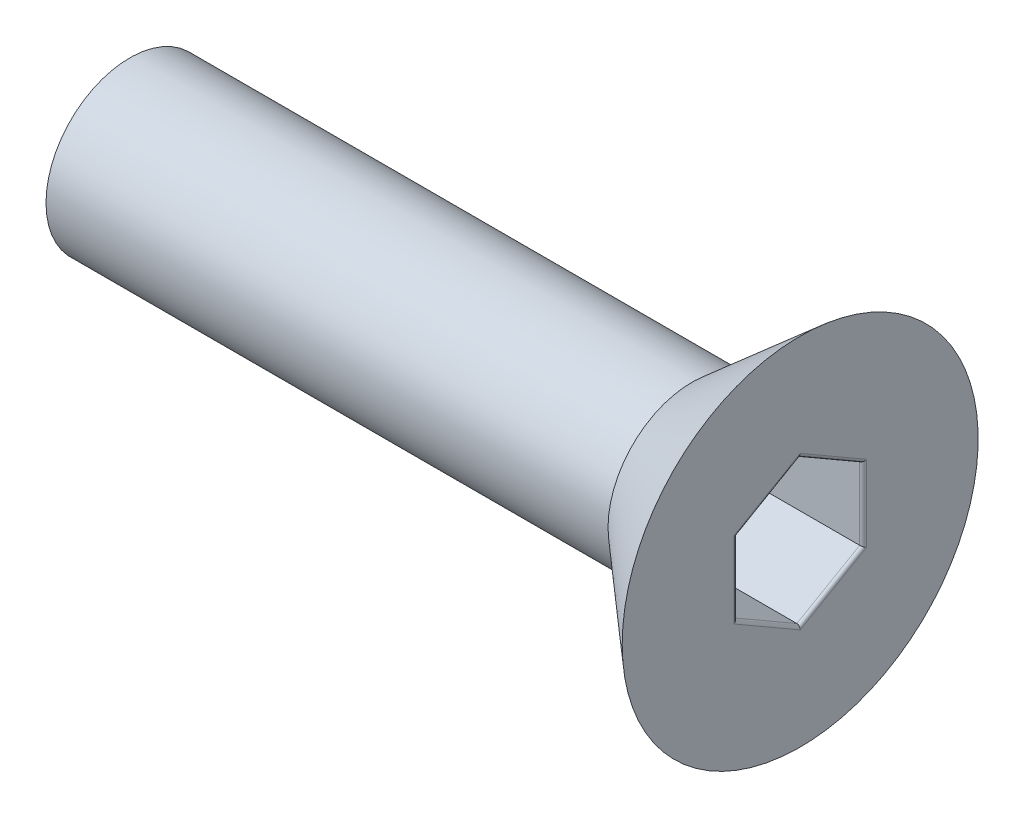
ISO-10303-21;
HEADER;
FILE_DESCRIPTION(('STEP AP214'),'2;1');
FILE_NAME('part.step','',(''),(''),'','','');
FILE_SCHEMA(('AUTOMOTIVE_DESIGN { 1 0 10303 214 1 1 1 1 }'));
ENDSEC;
DATA;
#1=APPLICATION_CONTEXT('core data for automotive mechanical design processes');
#2=APPLICATION_PROTOCOL_DEFINITION('international standard','automotive_design',2000,#1);
#3=PRODUCT_CONTEXT('',#1,'mechanical');
#4=PRODUCT('Part','Part','',(#3));
#5=PRODUCT_RELATED_PRODUCT_CATEGORY('part','',(#4));
#6=PRODUCT_DEFINITION_FORMATION('','',#4);
#7=PRODUCT_DEFINITION_CONTEXT('part definition',#1,'design');
#8=PRODUCT_DEFINITION('design','',#6,#7);
#9=PRODUCT_DEFINITION_SHAPE('','',#8);
#10=(LENGTH_UNIT() NAMED_UNIT(*) SI_UNIT(.MILLI.,.METRE.));
#11=(NAMED_UNIT(*) PLANE_ANGLE_UNIT() SI_UNIT($,.RADIAN.));
#12=(NAMED_UNIT(*) SI_UNIT($,.STERADIAN.) SOLID_ANGLE_UNIT());
#13=UNCERTAINTY_MEASURE_WITH_UNIT(LENGTH_MEASURE(1.E-05),#10,'distance_accuracy_value','');
#14=(GEOMETRIC_REPRESENTATION_CONTEXT(3) GLOBAL_UNCERTAINTY_ASSIGNED_CONTEXT((#13)) GLOBAL_UNIT_ASSIGNED_CONTEXT((#10,
#11,#12)) REPRESENTATION_CONTEXT('',''));
#15=CARTESIAN_POINT('',(0.,0.,0.));
#16=DIRECTION('',(0.,0.,1.));
#17=DIRECTION('',(1.,0.,0.));
#18=AXIS2_PLACEMENT_3D('',#15,#16,#17);
#19=CARTESIAN_POINT('',(0.,0.,0.));
#20=DIRECTION('',(-1.,0.,0.));
#21=DIRECTION('',(0.,0.,1.));
#22=AXIS2_PLACEMENT_3D('',#19,#20,#21);
#23=PLANE('',#22);
#24=DIRECTION('',(0.,0.5,0.866025403784439));
#25=VECTOR('',#24,1.);
#26=CARTESIAN_POINT('',(0.,2.17220821904232,-1.254125));
#27=LINE('',#26,#25);
#28=CARTESIAN_POINT('',(0.,2.89627762538976,0.));
#29=VERTEX_POINT('',#28);
#30=CARTESIAN_POINT('',(0.,1.44813881269488,-2.50825));
#31=VERTEX_POINT('',#30);
#32=EDGE_CURVE('E157',#29,#31,#27,.F.);
#33=ORIENTED_EDGE('',*,*,#32,.T.);
#34=DIRECTION('',(0.,1.,0.));
#35=VECTOR('',#34,1.);
#36=CARTESIAN_POINT('',(0.,0.,-2.50825));
#37=LINE('',#36,#35);
#38=CARTESIAN_POINT('',(0.,-1.44813881269488,-2.50825));
#39=VERTEX_POINT('',#38);
#40=EDGE_CURVE('E167',#31,#39,#37,.F.);
#41=ORIENTED_EDGE('',*,*,#40,.T.);
#42=DIRECTION('',(0.,0.5,-0.866025403784439));
#43=VECTOR('',#42,1.);
#44=CARTESIAN_POINT('',(0.,-2.17220821904232,-1.254125));
#45=LINE('',#44,#43);
#46=CARTESIAN_POINT('',(0.,-2.89627762538976,0.));
#47=VERTEX_POINT('',#46);
#48=EDGE_CURVE('E165',#39,#47,#45,.F.);
#49=ORIENTED_EDGE('',*,*,#48,.T.);
#50=DIRECTION('',(0.,-0.5,-0.866025403784439));
#51=VECTOR('',#50,1.);
#52=CARTESIAN_POINT('',(0.,-2.17220821904232,1.254125));
#53=LINE('',#52,#51);
#54=CARTESIAN_POINT('',(0.,-1.44813881269488,2.50825));
#55=VERTEX_POINT('',#54);
#56=EDGE_CURVE('E163',#47,#55,#53,.F.);
#57=ORIENTED_EDGE('',*,*,#56,.T.);
#58=DIRECTION('',(0.,-1.,0.));
#59=VECTOR('',#58,1.);
#60=CARTESIAN_POINT('',(0.,0.,2.50825));
#61=LINE('',#60,#59);
#62=CARTESIAN_POINT('',(0.,1.44813881269488,2.50825));
#63=VERTEX_POINT('',#62);
#64=EDGE_CURVE('E161',#55,#63,#61,.F.);
#65=ORIENTED_EDGE('',*,*,#64,.T.);
#66=DIRECTION('',(0.,-0.5,0.866025403784439));
#67=VECTOR('',#66,1.);
#68=CARTESIAN_POINT('',(0.,2.17220821904232,1.254125));
#69=LINE('',#68,#67);
#70=EDGE_CURVE('E159',#63,#29,#69,.F.);
#71=ORIENTED_EDGE('',*,*,#70,.T.);
#72=EDGE_LOOP('',(#33,#41,#49,#57,#65,#71));
#73=FACE_BOUND('',#72,.T.);
#74=CARTESIAN_POINT('',(0.,0.,0.));
#75=DIRECTION('',(-1.,0.,0.));
#76=DIRECTION('',(0.,0.,1.));
#77=AXIS2_PLACEMENT_3D('',#74,#75,#76);
#78=CIRCLE('',#77,6.7437);
#79=CARTESIAN_POINT('',(0.,0.,6.7437));
#80=VERTEX_POINT('',#79);
#81=EDGE_CURVE('E151',#80,#80,#78,.T.);
#82=ORIENTED_EDGE('',*,*,#81,.F.);
#83=EDGE_LOOP('',(#82));
#84=FACE_BOUND('',#83,.T.);
#85=ADVANCED_FACE('F33',(#73,#84),#23,.F.);
#86=CARTESIAN_POINT('',(0.,0.,0.));
#87=DIRECTION('',(1.,0.,0.));
#88=DIRECTION('',(0.,0.,-1.));
#89=AXIS2_PLACEMENT_3D('',#86,#87,#88);
#90=CONICAL_SURFACE('',#89,6.7437,0.71558499331767);
#91=CARTESIAN_POINT('',(-4.10531973484966,0.,0.));
#92=DIRECTION('',(-1.,0.,0.));
#93=DIRECTION('',(0.,0.,1.));
#94=AXIS2_PLACEMENT_3D('',#91,#92,#93);
#95=CIRCLE('',#94,3.175);
#96=CARTESIAN_POINT('',(-4.10531973484966,0.,3.175));
#97=VERTEX_POINT('',#96);
#98=EDGE_CURVE('E148',#97,#97,#95,.T.);
#99=ORIENTED_EDGE('',*,*,#98,.F.);
#100=EDGE_LOOP('',(#99));
#101=FACE_BOUND('',#100,.T.);
#102=ORIENTED_EDGE('',*,*,#81,.T.);
#103=EDGE_LOOP('',(#102));
#104=FACE_BOUND('',#103,.T.);
#105=ADVANCED_FACE('F235',(#101,#104),#90,.T.);
#106=CARTESIAN_POINT('',(-25.4,0.,0.));
#107=DIRECTION('',(-1.,0.,0.));
#108=DIRECTION('',(0.,0.,1.));
#109=AXIS2_PLACEMENT_3D('',#106,#107,#108);
#110=CYLINDRICAL_SURFACE('',#109,3.175);
#111=CARTESIAN_POINT('',(-25.4,0.,0.));
#112=DIRECTION('',(-1.,0.,0.));
#113=DIRECTION('',(0.,0.,1.));
#114=AXIS2_PLACEMENT_3D('',#111,#112,#113);
#115=CIRCLE('',#114,3.175);
#116=CARTESIAN_POINT('',(-25.4,0.,3.175));
#117=VERTEX_POINT('',#116);
#118=EDGE_CURVE('E135',#117,#117,#115,.T.);
#119=ORIENTED_EDGE('',*,*,#118,.F.);
#120=EDGE_LOOP('',(#119));
#121=FACE_BOUND('',#120,.T.);
#122=ORIENTED_EDGE('',*,*,#98,.T.);
#123=EDGE_LOOP('',(#122));
#124=FACE_BOUND('',#123,.T.);
#125=ADVANCED_FACE('F240',(#121,#124),#110,.T.);
#126=CARTESIAN_POINT('',(-25.4,0.,-3.175));
#127=DIRECTION('',(1.,0.,0.));
#128=DIRECTION('',(0.,0.,-1.));
#129=AXIS2_PLACEMENT_3D('',#126,#127,#128);
#130=PLANE('',#129);
#131=ORIENTED_EDGE('',*,*,#118,.T.);
#132=EDGE_LOOP('',(#131));
#133=FACE_BOUND('',#132,.T.);
#134=ADVANCED_FACE('F271',(#133),#130,.F.);
#135=CARTESIAN_POINT('',(-3.81,1.3748153285078,-2.38125));
#136=DIRECTION('',(0.,0.866025403784439,-0.5));
#137=DIRECTION('',(0.,0.5,0.866025403784439));
#138=AXIS2_PLACEMENT_3D('',#135,#136,#137);
#139=PLANE('',#138);
#140=DIRECTION('',(1.,0.,0.));
#141=VECTOR('',#140,1.);
#142=CARTESIAN_POINT('',(-3.81,1.3748153285078,-2.38125));
#143=LINE('',#142,#141);
#144=CARTESIAN_POINT('',(-3.81,1.3748153285078,-2.38125));
#145=VERTEX_POINT('',#144);
#146=CARTESIAN_POINT('',(-0.127000000000001,1.3748153285078,-2.38125));
#147=VERTEX_POINT('',#146);
#148=EDGE_CURVE('E133',#145,#147,#143,.T.);
#149=ORIENTED_EDGE('',*,*,#148,.T.);
#150=DIRECTION('',(0.,0.5,0.866025403784439));
#151=VECTOR('',#150,1.);
#152=CARTESIAN_POINT('',(-0.127,1.3748153285078,-2.38125));
#153=LINE('',#152,#151);
#154=CARTESIAN_POINT('',(-0.127000000000001,2.7496306570156,0.));
#155=VERTEX_POINT('',#154);
#156=EDGE_CURVE('E11',#147,#155,#153,.T.);
#157=ORIENTED_EDGE('',*,*,#156,.T.);
#158=DIRECTION('',(1.,0.,0.));
#159=VECTOR('',#158,1.);
#160=CARTESIAN_POINT('',(-3.81,2.7496306570156,0.));
#161=LINE('',#160,#159);
#162=CARTESIAN_POINT('',(-3.81,2.7496306570156,0.));
#163=VERTEX_POINT('',#162);
#164=EDGE_CURVE('E102',#163,#155,#161,.T.);
#165=ORIENTED_EDGE('',*,*,#164,.F.);
#166=DIRECTION('',(0.,0.5,0.866025403784439));
#167=VECTOR('',#166,1.);
#168=CARTESIAN_POINT('',(-3.81,1.3748153285078,-2.38125));
#169=LINE('',#168,#167);
#170=EDGE_CURVE('E106',#145,#163,#169,.T.);
#171=ORIENTED_EDGE('',*,*,#170,.F.);
#172=EDGE_LOOP('',(#149,#157,#165,#171));
#173=FACE_BOUND('',#172,.T.);
#174=ADVANCED_FACE('F104',(#173),#139,.F.);
#175=CARTESIAN_POINT('',(-3.81,-1.3748153285078,-2.38125));
#176=DIRECTION('',(0.,0.,-1.));
#177=DIRECTION('',(-1.,0.,0.));
#178=AXIS2_PLACEMENT_3D('',#175,#176,#177);
#179=PLANE('',#178);
#180=DIRECTION('',(1.,0.,0.));
#181=VECTOR('',#180,1.);
#182=CARTESIAN_POINT('',(-3.81,-1.3748153285078,-2.38125));
#183=LINE('',#182,#181);
#184=CARTESIAN_POINT('',(-3.81,-1.3748153285078,-2.38125));
#185=VERTEX_POINT('',#184);
#186=CARTESIAN_POINT('',(-0.127000000000001,-1.3748153285078,-2.38125));
#187=VERTEX_POINT('',#186);
#188=EDGE_CURVE('E136',#185,#187,#183,.T.);
#189=ORIENTED_EDGE('',*,*,#188,.T.);
#190=DIRECTION('',(0.,1.,0.));
#191=VECTOR('',#190,1.);
#192=CARTESIAN_POINT('',(-0.127,-1.3748153285078,-2.38125));
#193=LINE('',#192,#191);
#194=EDGE_CURVE('E154',#187,#147,#193,.T.);
#195=ORIENTED_EDGE('',*,*,#194,.T.);
#196=ORIENTED_EDGE('',*,*,#148,.F.);
#197=DIRECTION('',(0.,1.,0.));
#198=VECTOR('',#197,1.);
#199=CARTESIAN_POINT('',(-3.81,-1.3748153285078,-2.38125));
#200=LINE('',#199,#198);
#201=EDGE_CURVE('E109',#185,#145,#200,.T.);
#202=ORIENTED_EDGE('',*,*,#201,.F.);
#203=EDGE_LOOP('',(#189,#195,#196,#202));
#204=FACE_BOUND('',#203,.T.);
#205=ADVANCED_FACE('F205',(#204),#179,.F.);
#206=CARTESIAN_POINT('',(-3.81,-2.74963065701559,0.));
#207=DIRECTION('',(0.,-0.866025403784439,-0.5));
#208=DIRECTION('',(0.,0.5,-0.866025403784439));
#209=AXIS2_PLACEMENT_3D('',#206,#207,#208);
#210=PLANE('',#209);
#211=DIRECTION('',(1.,0.,0.));
#212=VECTOR('',#211,1.);
#213=CARTESIAN_POINT('',(-3.81,-2.74963065701559,0.));
#214=LINE('',#213,#212);
#215=CARTESIAN_POINT('',(-3.81,-2.74963065701559,0.));
#216=VERTEX_POINT('',#215);
#217=CARTESIAN_POINT('',(-0.127000000000001,-2.74963065701559,0.));
#218=VERTEX_POINT('',#217);
#219=EDGE_CURVE('E139',#216,#218,#214,.T.);
#220=ORIENTED_EDGE('',*,*,#219,.T.);
#221=DIRECTION('',(0.,0.5,-0.866025403784439));
#222=VECTOR('',#221,1.);
#223=CARTESIAN_POINT('',(-0.127,-2.74963065701559,0.));
#224=LINE('',#223,#222);
#225=EDGE_CURVE('E170',#218,#187,#224,.T.);
#226=ORIENTED_EDGE('',*,*,#225,.T.);
#227=ORIENTED_EDGE('',*,*,#188,.F.);
#228=DIRECTION('',(0.,0.5,-0.866025403784439));
#229=VECTOR('',#228,1.);
#230=CARTESIAN_POINT('',(-3.81,-2.74963065701559,0.));
#231=LINE('',#230,#229);
#232=EDGE_CURVE('E130',#216,#185,#231,.T.);
#233=ORIENTED_EDGE('',*,*,#232,.F.);
#234=EDGE_LOOP('',(#220,#226,#227,#233));
#235=FACE_BOUND('',#234,.T.);
#236=ADVANCED_FACE('F225',(#235),#210,.F.);
#237=CARTESIAN_POINT('',(-3.81,-1.3748153285078,2.38125));
#238=DIRECTION('',(0.,-0.866025403784438,0.5));
#239=DIRECTION('',(0.,-0.5,-0.866025403784439));
#240=AXIS2_PLACEMENT_3D('',#237,#238,#239);
#241=PLANE('',#240);
#242=DIRECTION('',(1.,0.,0.));
#243=VECTOR('',#242,1.);
#244=CARTESIAN_POINT('',(-3.81,-1.3748153285078,2.38125));
#245=LINE('',#244,#243);
#246=CARTESIAN_POINT('',(-3.81,-1.3748153285078,2.38125));
#247=VERTEX_POINT('',#246);
#248=CARTESIAN_POINT('',(-0.127000000000001,-1.3748153285078,2.38125));
#249=VERTEX_POINT('',#248);
#250=EDGE_CURVE('E142',#247,#249,#245,.T.);
#251=ORIENTED_EDGE('',*,*,#250,.T.);
#252=DIRECTION('',(0.,-0.5,-0.866025403784439));
#253=VECTOR('',#252,1.);
#254=CARTESIAN_POINT('',(-0.127,-1.3748153285078,2.38125));
#255=LINE('',#254,#253);
#256=EDGE_CURVE('E172',#249,#218,#255,.T.);
#257=ORIENTED_EDGE('',*,*,#256,.T.);
#258=ORIENTED_EDGE('',*,*,#219,.F.);
#259=DIRECTION('',(0.,-0.5,-0.866025403784439));
#260=VECTOR('',#259,1.);
#261=CARTESIAN_POINT('',(-3.81,-1.3748153285078,2.38125));
#262=LINE('',#261,#260);
#263=EDGE_CURVE('E127',#247,#216,#262,.T.);
#264=ORIENTED_EDGE('',*,*,#263,.F.);
#265=EDGE_LOOP('',(#251,#257,#258,#264));
#266=FACE_BOUND('',#265,.T.);
#267=ADVANCED_FACE('F201',(#266),#241,.F.);
#268=CARTESIAN_POINT('',(-3.81,1.3748153285078,2.38125));
#269=DIRECTION('',(0.,0.,1.));
#270=DIRECTION('',(0.,-1.,0.));
#271=AXIS2_PLACEMENT_3D('',#268,#269,#270);
#272=PLANE('',#271);
#273=DIRECTION('',(1.,0.,0.));
#274=VECTOR('',#273,1.);
#275=CARTESIAN_POINT('',(-3.81,1.3748153285078,2.38125));
#276=LINE('',#275,#274);
#277=CARTESIAN_POINT('',(-3.81,1.3748153285078,2.38125));
#278=VERTEX_POINT('',#277);
#279=CARTESIAN_POINT('',(-0.127000000000001,1.3748153285078,2.38125));
#280=VERTEX_POINT('',#279);
#281=EDGE_CURVE('E108',#278,#280,#276,.T.);
#282=ORIENTED_EDGE('',*,*,#281,.T.);
#283=DIRECTION('',(0.,-1.,0.));
#284=VECTOR('',#283,1.);
#285=CARTESIAN_POINT('',(-0.127,1.3748153285078,2.38125));
#286=LINE('',#285,#284);
#287=EDGE_CURVE('E174',#280,#249,#286,.T.);
#288=ORIENTED_EDGE('',*,*,#287,.T.);
#289=ORIENTED_EDGE('',*,*,#250,.F.);
#290=DIRECTION('',(0.,-1.,0.));
#291=VECTOR('',#290,1.);
#292=CARTESIAN_POINT('',(-3.81,1.3748153285078,2.38125));
#293=LINE('',#292,#291);
#294=EDGE_CURVE('E117',#278,#247,#293,.T.);
#295=ORIENTED_EDGE('',*,*,#294,.F.);
#296=EDGE_LOOP('',(#282,#288,#289,#295));
#297=FACE_BOUND('',#296,.T.);
#298=ADVANCED_FACE('F198',(#297),#272,.F.);
#299=CARTESIAN_POINT('',(-3.81,2.7496306570156,0.));
#300=DIRECTION('',(0.,0.866025403784439,0.5));
#301=DIRECTION('',(0.,-0.5,0.866025403784439));
#302=AXIS2_PLACEMENT_3D('',#299,#300,#301);
#303=PLANE('',#302);
#304=ORIENTED_EDGE('',*,*,#164,.T.);
#305=DIRECTION('',(0.,-0.5,0.866025403784439));
#306=VECTOR('',#305,1.);
#307=CARTESIAN_POINT('',(-0.127,2.7496306570156,0.));
#308=LINE('',#307,#306);
#309=EDGE_CURVE('E42',#155,#280,#308,.T.);
#310=ORIENTED_EDGE('',*,*,#309,.T.);
#311=ORIENTED_EDGE('',*,*,#281,.F.);
#312=DIRECTION('',(0.,-0.5,0.866025403784439));
#313=VECTOR('',#312,1.);
#314=CARTESIAN_POINT('',(-3.81,2.7496306570156,0.));
#315=LINE('',#314,#313);
#316=EDGE_CURVE('E112',#163,#278,#315,.T.);
#317=ORIENTED_EDGE('',*,*,#316,.F.);
#318=EDGE_LOOP('',(#304,#310,#311,#317));
#319=FACE_BOUND('',#318,.T.);
#320=ADVANCED_FACE('F113',(#319),#303,.F.);
#321=CARTESIAN_POINT('',(-3.81,2.7496306570156,0.));
#322=DIRECTION('',(1.,0.,0.));
#323=DIRECTION('',(0.,0.,-1.));
#324=AXIS2_PLACEMENT_3D('',#321,#322,#323);
#325=PLANE('',#324);
#326=ORIENTED_EDGE('',*,*,#170,.T.);
#327=ORIENTED_EDGE('',*,*,#316,.T.);
#328=ORIENTED_EDGE('',*,*,#294,.T.);
#329=ORIENTED_EDGE('',*,*,#263,.T.);
#330=ORIENTED_EDGE('',*,*,#232,.T.);
#331=ORIENTED_EDGE('',*,*,#201,.T.);
#332=EDGE_LOOP('',(#326,#327,#328,#329,#330,#331));
#333=FACE_BOUND('',#332,.T.);
#334=ADVANCED_FACE('F119',(#333),#325,.T.);
#335=CARTESIAN_POINT('',(-0.127,1.3748153285078,2.50825));
#336=DIRECTION('',(0.,-1.,0.));
#337=DIRECTION('',(0.,0.,-1.));
#338=AXIS2_PLACEMENT_3D('',#335,#336,#337);
#339=CYLINDRICAL_SURFACE('',#338,0.127);
#340=CARTESIAN_POINT('',(-0.127,1.44813881269488,2.50825));
#341=DIRECTION('',(0.,-0.866025403784439,0.5));
#342=DIRECTION('',(0.,-0.5,-0.866025403784439));
#343=AXIS2_PLACEMENT_3D('',#340,#341,#342);
#344=ELLIPSE('',#343,0.146646968374165,0.127);
#345=EDGE_CURVE('E124',#63,#280,#344,.F.);
#346=ORIENTED_EDGE('',*,*,#345,.F.);
#347=ORIENTED_EDGE('',*,*,#64,.F.);
#348=CARTESIAN_POINT('',(-0.127,-1.44813881269488,2.50825));
#349=DIRECTION('',(0.,-0.866025403784439,-0.5));
#350=DIRECTION('',(0.,0.5,-0.866025403784439));
#351=AXIS2_PLACEMENT_3D('',#348,#349,#350);
#352=ELLIPSE('',#351,0.146646968374165,0.127);
#353=EDGE_CURVE('E37',#249,#55,#352,.T.);
#354=ORIENTED_EDGE('',*,*,#353,.F.);
#355=ORIENTED_EDGE('',*,*,#287,.F.);
#356=EDGE_LOOP('',(#346,#347,#354,#355));
#357=FACE_BOUND('',#356,.T.);
#358=ADVANCED_FACE('F35',(#357),#339,.T.);
#359=CARTESIAN_POINT('',(-0.127,-1.48480055478842,2.44475));
#360=DIRECTION('',(0.,-0.5,-0.866025403784439));
#361=DIRECTION('',(0.,0.866025403784438,-0.5));
#362=AXIS2_PLACEMENT_3D('',#359,#360,#361);
#363=CYLINDRICAL_SURFACE('',#362,0.127);
#364=ORIENTED_EDGE('',*,*,#353,.T.);
#365=ORIENTED_EDGE('',*,*,#56,.F.);
#366=CARTESIAN_POINT('',(-0.127,-2.89627762538976,0.));
#367=DIRECTION('',(0.,0.,-1.));
#368=DIRECTION('',(0.,1.,0.));
#369=AXIS2_PLACEMENT_3D('',#366,#367,#368);
#370=ELLIPSE('',#369,0.146646968374165,0.127);
#371=EDGE_CURVE('E184',#218,#47,#370,.T.);
#372=ORIENTED_EDGE('',*,*,#371,.F.);
#373=ORIENTED_EDGE('',*,*,#256,.F.);
#374=EDGE_LOOP('',(#364,#365,#372,#373));
#375=FACE_BOUND('',#374,.T.);
#376=ADVANCED_FACE('F221',(#375),#363,.T.);
#377=CARTESIAN_POINT('',(-0.127,2.85961588329622,0.0634999999999999));
#378=DIRECTION('',(0.,-0.5,0.866025403784439));
#379=DIRECTION('',(0.,-0.866025403784439,-0.5));
#380=AXIS2_PLACEMENT_3D('',#377,#378,#379);
#381=CYLINDRICAL_SURFACE('',#380,0.127);
#382=ORIENTED_EDGE('',*,*,#345,.T.);
#383=ORIENTED_EDGE('',*,*,#309,.F.);
#384=CARTESIAN_POINT('',(-0.127,2.89627762538976,0.));
#385=DIRECTION('',(0.,0.,1.));
#386=DIRECTION('',(0.,-1.,0.));
#387=AXIS2_PLACEMENT_3D('',#384,#385,#386);
#388=ELLIPSE('',#387,0.146646968374165,0.127);
#389=EDGE_CURVE('E181',#29,#155,#388,.F.);
#390=ORIENTED_EDGE('',*,*,#389,.F.);
#391=ORIENTED_EDGE('',*,*,#70,.F.);
#392=EDGE_LOOP('',(#382,#383,#390,#391));
#393=FACE_BOUND('',#392,.T.);
#394=ADVANCED_FACE('F190',(#393),#381,.T.);
#395=CARTESIAN_POINT('',(-0.127,-2.85961588329622,-0.0634999999999989));
#396=DIRECTION('',(0.,0.5,-0.866025403784439));
#397=DIRECTION('',(0.,0.866025403784439,0.5));
#398=AXIS2_PLACEMENT_3D('',#395,#396,#397);
#399=CYLINDRICAL_SURFACE('',#398,0.127);
#400=ORIENTED_EDGE('',*,*,#371,.T.);
#401=ORIENTED_EDGE('',*,*,#48,.F.);
#402=CARTESIAN_POINT('',(-0.127,-1.44813881269488,-2.50825));
#403=DIRECTION('',(0.,0.866025403784439,-0.5));
#404=DIRECTION('',(0.,0.5,0.866025403784439));
#405=AXIS2_PLACEMENT_3D('',#402,#403,#404);
#406=ELLIPSE('',#405,0.146646968374165,0.127);
#407=EDGE_CURVE('E179',#187,#39,#406,.T.);
#408=ORIENTED_EDGE('',*,*,#407,.F.);
#409=ORIENTED_EDGE('',*,*,#225,.F.);
#410=EDGE_LOOP('',(#400,#401,#408,#409));
#411=FACE_BOUND('',#410,.T.);
#412=ADVANCED_FACE('F224',(#411),#399,.T.);
#413=CARTESIAN_POINT('',(-0.127,1.48480055478842,-2.44475));
#414=DIRECTION('',(0.,0.5,0.866025403784439));
#415=DIRECTION('',(0.,-0.866025403784439,0.5));
#416=AXIS2_PLACEMENT_3D('',#413,#414,#415);
#417=CYLINDRICAL_SURFACE('',#416,0.127);
#418=ORIENTED_EDGE('',*,*,#389,.T.);
#419=ORIENTED_EDGE('',*,*,#156,.F.);
#420=CARTESIAN_POINT('',(-0.127,1.44813881269488,-2.50825));
#421=DIRECTION('',(0.,0.866025403784439,0.5));
#422=DIRECTION('',(0.,0.5,-0.866025403784439));
#423=AXIS2_PLACEMENT_3D('',#420,#421,#422);
#424=ELLIPSE('',#423,0.146646968374165,0.127);
#425=EDGE_CURVE('E177',#31,#147,#424,.F.);
#426=ORIENTED_EDGE('',*,*,#425,.F.);
#427=ORIENTED_EDGE('',*,*,#32,.F.);
#428=EDGE_LOOP('',(#418,#419,#426,#427));
#429=FACE_BOUND('',#428,.T.);
#430=ADVANCED_FACE('F215',(#429),#417,.T.);
#431=CARTESIAN_POINT('',(-0.127,-1.3748153285078,-2.50825));
#432=DIRECTION('',(0.,1.,0.));
#433=DIRECTION('',(0.,0.,1.));
#434=AXIS2_PLACEMENT_3D('',#431,#432,#433);
#435=CYLINDRICAL_SURFACE('',#434,0.127);
#436=ORIENTED_EDGE('',*,*,#407,.T.);
#437=ORIENTED_EDGE('',*,*,#40,.F.);
#438=ORIENTED_EDGE('',*,*,#425,.T.);
#439=ORIENTED_EDGE('',*,*,#194,.F.);
#440=EDGE_LOOP('',(#436,#437,#438,#439));
#441=FACE_BOUND('',#440,.T.);
#442=ADVANCED_FACE('F209',(#441),#435,.T.);
#443=CLOSED_SHELL('',(#85,#105,#125,#134,#174,#205,#236,#267,#298,#320,#334,#358,#376,#394,#412,
#430,#442));
#444=MANIFOLD_SOLID_BREP('B2',#443);
#445=ADVANCED_BREP_SHAPE_REPRESENTATION('',(#18,#444),#14);
#446=SHAPE_DEFINITION_REPRESENTATION(#9,#445);
ENDSEC;
END-ISO-10303-21;
